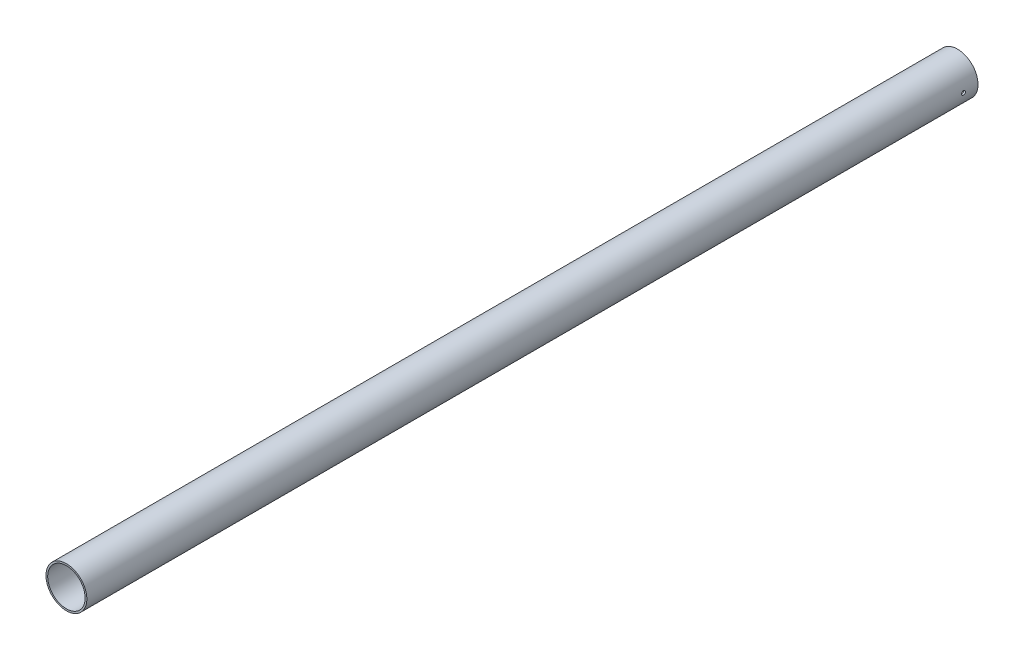
ISO-10303-21;
HEADER;
FILE_DESCRIPTION(('STEP AP214'),'2;1');
FILE_NAME('part.step','',(''),(''),'','','');
FILE_SCHEMA(('AUTOMOTIVE_DESIGN { 1 0 10303 214 1 1 1 1 }'));
ENDSEC;
DATA;
#1=APPLICATION_CONTEXT('core data for automotive mechanical design processes');
#2=APPLICATION_PROTOCOL_DEFINITION('international standard','automotive_design',2000,#1);
#3=PRODUCT_CONTEXT('',#1,'mechanical');
#4=PRODUCT('Part','Part','',(#3));
#5=PRODUCT_RELATED_PRODUCT_CATEGORY('part','',(#4));
#6=PRODUCT_DEFINITION_FORMATION('','',#4);
#7=PRODUCT_DEFINITION_CONTEXT('part definition',#1,'design');
#8=PRODUCT_DEFINITION('design','',#6,#7);
#9=PRODUCT_DEFINITION_SHAPE('','',#8);
#10=(LENGTH_UNIT() NAMED_UNIT(*) SI_UNIT(.MILLI.,.METRE.));
#11=(NAMED_UNIT(*) PLANE_ANGLE_UNIT() SI_UNIT($,.RADIAN.));
#12=(NAMED_UNIT(*) SI_UNIT($,.STERADIAN.) SOLID_ANGLE_UNIT());
#13=UNCERTAINTY_MEASURE_WITH_UNIT(LENGTH_MEASURE(1.E-05),#10,'distance_accuracy_value','');
#14=(GEOMETRIC_REPRESENTATION_CONTEXT(3) GLOBAL_UNCERTAINTY_ASSIGNED_CONTEXT((#13)) GLOBAL_UNIT_ASSIGNED_CONTEXT((#10,
#11,#12)) REPRESENTATION_CONTEXT('',''));
#15=CARTESIAN_POINT('',(0.,0.,0.));
#16=DIRECTION('',(0.,0.,1.));
#17=DIRECTION('',(1.,0.,0.));
#18=AXIS2_PLACEMENT_3D('',#15,#16,#17);
#19=CARTESIAN_POINT('',(0.,0.,553.63));
#20=DIRECTION('',(0.,0.,1.));
#21=DIRECTION('',(1.,0.,0.));
#22=AXIS2_PLACEMENT_3D('',#19,#20,#21);
#23=PLANE('',#22);
#24=CARTESIAN_POINT('',(0.,0.,553.63));
#25=DIRECTION('',(0.,0.,1.));
#26=DIRECTION('',(1.,0.,0.));
#27=AXIS2_PLACEMENT_3D('',#24,#25,#26);
#28=CIRCLE('',#27,12.7);
#29=CARTESIAN_POINT('',(12.7,0.,553.63));
#30=VERTEX_POINT('',#29);
#31=EDGE_CURVE('E54',#30,#30,#28,.T.);
#32=ORIENTED_EDGE('',*,*,#31,.T.);
#33=EDGE_LOOP('',(#32));
#34=FACE_BOUND('',#33,.T.);
#35=CARTESIAN_POINT('',(0.,0.,553.63));
#36=DIRECTION('',(0.,0.,1.));
#37=DIRECTION('',(1.,0.,0.));
#38=AXIS2_PLACEMENT_3D('',#35,#36,#37);
#39=CIRCLE('',#38,11.6205);
#40=CARTESIAN_POINT('',(11.6205,0.,553.63));
#41=VERTEX_POINT('',#40);
#42=EDGE_CURVE('E91',#41,#41,#39,.T.);
#43=ORIENTED_EDGE('',*,*,#42,.F.);
#44=EDGE_LOOP('',(#43));
#45=FACE_BOUND('',#44,.T.);
#46=ADVANCED_FACE('F36',(#34,#45),#23,.T.);
#47=CARTESIAN_POINT('',(0.,0.,0.));
#48=DIRECTION('',(0.,0.,1.));
#49=DIRECTION('',(1.,0.,0.));
#50=AXIS2_PLACEMENT_3D('',#47,#48,#49);
#51=PLANE('',#50);
#52=CARTESIAN_POINT('',(0.,0.,0.));
#53=DIRECTION('',(0.,0.,1.));
#54=DIRECTION('',(1.,0.,0.));
#55=AXIS2_PLACEMENT_3D('',#52,#53,#54);
#56=CIRCLE('',#55,12.7);
#57=CARTESIAN_POINT('',(12.7,0.,0.));
#58=VERTEX_POINT('',#57);
#59=EDGE_CURVE('E59',#58,#58,#56,.T.);
#60=ORIENTED_EDGE('',*,*,#59,.F.);
#61=EDGE_LOOP('',(#60));
#62=FACE_BOUND('',#61,.T.);
#63=CARTESIAN_POINT('',(0.,0.,0.));
#64=DIRECTION('',(0.,0.,1.));
#65=DIRECTION('',(1.,0.,0.));
#66=AXIS2_PLACEMENT_3D('',#63,#64,#65);
#67=CIRCLE('',#66,11.6205);
#68=CARTESIAN_POINT('',(11.6205,0.,0.));
#69=VERTEX_POINT('',#68);
#70=EDGE_CURVE('E86',#69,#69,#67,.T.);
#71=ORIENTED_EDGE('',*,*,#70,.T.);
#72=EDGE_LOOP('',(#71));
#73=FACE_BOUND('',#72,.T.);
#74=ADVANCED_FACE('F99',(#62,#73),#51,.F.);
#75=CARTESIAN_POINT('',(0.,0.,553.63));
#76=DIRECTION('',(0.,0.,-1.));
#77=DIRECTION('',(-1.,0.,0.));
#78=AXIS2_PLACEMENT_3D('',#75,#76,#77);
#79=CYLINDRICAL_SURFACE('',#78,12.7);
#80=CARTESIAN_POINT('',(-12.7,0.,7.8));
#81=CARTESIAN_POINT('',(-12.6999992647351,0.0672436645791881,7.80000292110959));
#82=CARTESIAN_POINT('',(-12.6994602583645,0.134532250113994,7.80567116161042));
#83=CARTESIAN_POINT('',(-12.6973618829489,0.267245238753763,7.82819805892377));
#84=CARTESIAN_POINT('',(-12.6958013786043,0.332667483068381,7.84506916697964));
#85=CARTESIAN_POINT('',(-12.6918362274279,0.459706661698656,7.88950742482808));
#86=CARTESIAN_POINT('',(-12.6894320792388,0.521325818618373,7.91706825737999));
#87=CARTESIAN_POINT('',(-12.6840487416453,0.63904956472979,7.98209167980071));
#88=CARTESIAN_POINT('',(-12.6810696696504,0.695155276339263,8.01955224854545));
#89=CARTESIAN_POINT('',(-12.6748596357844,0.800454668942981,8.10344191042882));
#90=CARTESIAN_POINT('',(-12.6716279754825,0.849628048880857,8.1498964363571));
#91=CARTESIAN_POINT('',(-12.6652827978562,0.939492536562182,8.25040123796989));
#92=CARTESIAN_POINT('',(-12.6621692859032,0.980183259034829,8.30445185847214));
#93=CARTESIAN_POINT('',(-12.6564056786671,1.05199827487853,8.41874031392843));
#94=CARTESIAN_POINT('',(-12.6537564692717,1.08310436467755,8.47898963589863));
#95=CARTESIAN_POINT('',(-12.6492298785415,1.13475088033833,8.60388544776417));
#96=CARTESIAN_POINT('',(-12.6473524800529,1.15529154102306,8.66853183989585));
#97=CARTESIAN_POINT('',(-12.6445882565911,1.18516434657597,8.80018078070263));
#98=CARTESIAN_POINT('',(-12.6436984725554,1.19452998010332,8.86717566721294));
#99=CARTESIAN_POINT('',(-12.6430009858318,1.2018903732235,9.0017919315644));
#100=CARTESIAN_POINT('',(-12.64319325756,1.19988540166057,9.06941329455553));
#101=CARTESIAN_POINT('',(-12.644635459794,1.18458912582194,9.20313261711031));
#102=CARTESIAN_POINT('',(-12.6458819693004,1.17133432672263,9.26923479460722));
#103=CARTESIAN_POINT('',(-12.6492868463526,1.1339714218254,9.39827206357135));
#104=CARTESIAN_POINT('',(-12.6514452250248,1.10986318359523,9.46120711638331));
#105=CARTESIAN_POINT('',(-12.6564345841342,1.05143724752191,9.58223931649146));
#106=CARTESIAN_POINT('',(-12.6592666343216,1.01710328976211,9.64032856873999));
#107=CARTESIAN_POINT('',(-12.6652833045372,0.939212226192871,9.74993385326778));
#108=CARTESIAN_POINT('',(-12.6684679337701,0.895654879561493,9.80144971386001));
#109=CARTESIAN_POINT('',(-12.6748461723438,0.800349280584357,9.89665804404941));
#110=CARTESIAN_POINT('',(-12.6780397677479,0.748569490103312,9.94031895044983));
#111=CARTESIAN_POINT('',(-12.6840642400147,0.638398534577093,10.0183335706764));
#112=CARTESIAN_POINT('',(-12.6868951165338,0.580007363270718,10.0526872756883));
#113=CARTESIAN_POINT('',(-12.6918759754523,0.458249762567131,10.1111108065502));
#114=CARTESIAN_POINT('',(-12.6940258565343,0.39488259459694,10.1351791023379));
#115=CARTESIAN_POINT('',(-12.6974014179635,0.264981758608645,10.1723258349013));
#116=CARTESIAN_POINT('',(-12.6986271229789,0.198448175158765,10.185404565011));
#117=CARTESIAN_POINT('',(-12.7000130615517,0.0643765766885857,10.2001610317479));
#118=CARTESIAN_POINT('',(-12.700177366823,-0.00315660256509824,10.2018823379735));
#119=CARTESIAN_POINT('',(-12.699432896081,-0.137550513798226,10.1939894255829));
#120=CARTESIAN_POINT('',(-12.6985241329862,-0.204411253863348,10.1843753434327));
#121=CARTESIAN_POINT('',(-12.695738284362,-0.335437135549339,10.1541206969873));
#122=CARTESIAN_POINT('',(-12.6938629842485,-0.399607012285763,10.1335004610956));
#123=CARTESIAN_POINT('',(-12.6893545416645,-0.523576627788468,10.081839685859));
#124=CARTESIAN_POINT('',(-12.6867213839395,-0.583376278558557,10.0507989367634));
#125=CARTESIAN_POINT('',(-12.6809818377794,-0.69710539349013,9.97906971127578));
#126=CARTESIAN_POINT('',(-12.677874051145,-0.751016678858039,9.93835252544696));
#127=CARTESIAN_POINT('',(-12.671538680543,-0.851254884069771,9.84846750987874));
#128=CARTESIAN_POINT('',(-12.6683110938964,-0.897581634190501,9.7992994910811));
#129=CARTESIAN_POINT('',(-12.662087709054,-0.981486362284095,9.69371876400525));
#130=CARTESIAN_POINT('',(-12.6590926875178,-1.01903580222673,9.63728332443466));
#131=CARTESIAN_POINT('',(-12.6536850894959,-1.08412401495575,9.51888222746228));
#132=CARTESIAN_POINT('',(-12.6512725057894,-1.11166291185015,9.45691663863365));
#133=CARTESIAN_POINT('',(-12.6473076389668,-1.15590024040374,9.32931320204592));
#134=CARTESIAN_POINT('',(-12.6457539952817,-1.17261582352431,9.26368134434372));
#135=CARTESIAN_POINT('',(-12.6436785869436,-1.19478774945327,9.13052713180316));
#136=CARTESIAN_POINT('',(-12.6431567961441,-1.20024437755629,9.06300482491151));
#137=CARTESIAN_POINT('',(-12.6432046673143,-1.19973977686572,8.92827005230846));
#138=CARTESIAN_POINT('',(-12.6437700436999,-1.19382338026117,8.86105741265753));
#139=CARTESIAN_POINT('',(-12.6459194194394,-1.17083449453073,8.72858526111938));
#140=CARTESIAN_POINT('',(-12.647503420095,-1.15376199114879,8.6633257517281));
#141=CARTESIAN_POINT('',(-12.6515104007557,-1.10895754365353,8.53661155895532));
#142=CARTESIAN_POINT('',(-12.6539332907887,-1.08122674262402,8.47515646837689));
#143=CARTESIAN_POINT('',(-12.6593452297627,-1.01589760947404,8.35776621977284));
#144=CARTESIAN_POINT('',(-12.662334273539,-0.978299367367613,8.30183101139945));
#145=CARTESIAN_POINT('',(-12.6685558185134,-0.894134111279764,8.196838600714));
#146=CARTESIAN_POINT('',(-12.6717891970951,-0.847533739505933,8.14780819064974));
#147=CARTESIAN_POINT('',(-12.6781270617199,-0.746751576404293,8.0582424423319));
#148=CARTESIAN_POINT('',(-12.6812315165959,-0.692567965517046,8.01770914876575));
#149=CARTESIAN_POINT('',(-12.6869689662881,-0.578024127382161,7.94621723636115));
#150=CARTESIAN_POINT('',(-12.6896008678755,-0.51765007272362,7.91528070193364));
#151=CARTESIAN_POINT('',(-12.6940845081993,-0.39257889087562,7.86402498077978));
#152=CARTESIAN_POINT('',(-12.6959371321351,-0.327886766038709,7.84369374091456));
#153=CARTESIAN_POINT('',(-12.6981844213502,-0.21901908840564,7.81933347671279));
#154=CARTESIAN_POINT('',(-12.6988621150258,-0.175541004145001,7.81209323382703));
#155=CARTESIAN_POINT('',(-12.6997701442889,-0.0880483662317025,7.80242554767123));
#156=CARTESIAN_POINT('',(-12.7000004814806,-0.0440338145034741,7.79999808714176));
#157=CARTESIAN_POINT('',(-12.7,0.,7.8));
#158=B_SPLINE_CURVE_WITH_KNOTS('',3,(#80,#81,#82,#83,#84,#85,#86,#87,#88,#89,#90,#91,#92,#93,
#94,#95,#96,#97,#98,#99,#100,#101,#102,#103,#104,#105,#106,#107,#108,#109,#110,#111,#112,#113,
#114,#115,#116,#117,#118,#119,#120,#121,#122,#123,#124,#125,#126,#127,#128,#129,#130,#131,#132,
#133,#134,#135,#136,#137,#138,#139,#140,#141,#142,#143,#144,#145,#146,#147,#148,#149,#150,#151,
#152,#153,#154,#155,#156,#157),.UNSPECIFIED.,.T.,.F.,(4,2,2,2,2,2,2,2,2,2,2,2,2,2,2,2,2,2,2,2,2,
2,2,2,2,2,2,2,2,2,2,2,2,2,2,2,2,2,4),(0.,0.201570207034533,0.403364821789229,0.605040364479121,
0.806674764979918,1.0088878949915,1.21111020724929,1.41371425510745,1.61631379977508,
1.81830466893997,2.02029076229449,2.2216239149406,2.42295952429426,2.62461700233744,
2.82627974629062,3.02873555451505,3.23119155447361,3.43367766140465,3.63615836339395,
3.83786185059291,4.03956290952137,4.24089270855193,4.44222656031969,4.64416538445326,
4.84610872685956,5.04869979653931,5.25128835446376,5.45355508403256,5.65581668823045,
5.85728261681534,6.05874880284791,6.26019338801046,6.46163613559342,6.66384017563344,
6.86609281694631,7.06880749458907,7.27129127801421,7.40328790538686,7.53528405939677),.UNSPECIFIED.);
#159=CARTESIAN_POINT('',(-12.7,0.,7.8));
#160=VERTEX_POINT('',#159);
#161=EDGE_CURVE('E10',#160,#160,#158,.T.);
#162=ORIENTED_EDGE('',*,*,#161,.T.);
#163=EDGE_LOOP('',(#162));
#164=FACE_BOUND('',#163,.T.);
#165=CARTESIAN_POINT('',(12.7,0.,10.2));
#166=CARTESIAN_POINT('',(12.6999992647351,0.0672436645791882,10.1999970788904));
#167=CARTESIAN_POINT('',(12.6994602583645,0.134532250113994,10.1943288383896));
#168=CARTESIAN_POINT('',(12.6973618829489,0.267245238753763,10.1718019410762));
#169=CARTESIAN_POINT('',(12.6958013786043,0.332667483068382,10.1549308330204));
#170=CARTESIAN_POINT('',(12.6918362274279,0.459706661698656,10.1104925751719));
#171=CARTESIAN_POINT('',(12.6894320792388,0.521325818618373,10.08293174262));
#172=CARTESIAN_POINT('',(12.6840487416453,0.63904956472979,10.0179083201993));
#173=CARTESIAN_POINT('',(12.6810696696504,0.695155276339263,9.98044775145455));
#174=CARTESIAN_POINT('',(12.6748596357844,0.800454668942981,9.89655808957117));
#175=CARTESIAN_POINT('',(12.6716279754825,0.849628048880857,9.8501035636429));
#176=CARTESIAN_POINT('',(12.6652827978562,0.939492536562182,9.74959876203011));
#177=CARTESIAN_POINT('',(12.6621692859032,0.980183259034829,9.69554814152786));
#178=CARTESIAN_POINT('',(12.6564056786671,1.05199827487853,9.58125968607156));
#179=CARTESIAN_POINT('',(12.6537564692717,1.08310436467755,9.52101036410136));
#180=CARTESIAN_POINT('',(12.6492298785415,1.13475088033833,9.39611455223582));
#181=CARTESIAN_POINT('',(12.6473524800529,1.15529154102306,9.33146816010414));
#182=CARTESIAN_POINT('',(12.6445882565911,1.18516434657597,9.19981921929736));
#183=CARTESIAN_POINT('',(12.6436984725554,1.19452998010332,9.13282433278706));
#184=CARTESIAN_POINT('',(12.6430009858318,1.2018903732235,8.9982080684356));
#185=CARTESIAN_POINT('',(12.64319325756,1.19988540166057,8.93058670544446));
#186=CARTESIAN_POINT('',(12.644635459794,1.18458912582194,8.79686738288969));
#187=CARTESIAN_POINT('',(12.6458819693004,1.17133432672263,8.73076520539277));
#188=CARTESIAN_POINT('',(12.6492868463526,1.1339714218254,8.60172793642865));
#189=CARTESIAN_POINT('',(12.6514452250248,1.10986318359523,8.53879288361669));
#190=CARTESIAN_POINT('',(12.6564345841342,1.05143724752191,8.41776068350854));
#191=CARTESIAN_POINT('',(12.6592666343216,1.01710328976211,8.35967143126001));
#192=CARTESIAN_POINT('',(12.6652833045372,0.939212226192871,8.25006614673222));
#193=CARTESIAN_POINT('',(12.6684679337701,0.895654879561493,8.19855028613999));
#194=CARTESIAN_POINT('',(12.6748461723438,0.800349280584357,8.10334195595059));
#195=CARTESIAN_POINT('',(12.6780397677479,0.748569490103312,8.05968104955017));
#196=CARTESIAN_POINT('',(12.6840642400147,0.638398534577093,7.98166642932355));
#197=CARTESIAN_POINT('',(12.6868951165338,0.580007363270718,7.94731272431169));
#198=CARTESIAN_POINT('',(12.6918759754523,0.458249762567131,7.88888919344984));
#199=CARTESIAN_POINT('',(12.6940258565343,0.39488259459694,7.86482089766205));
#200=CARTESIAN_POINT('',(12.6974014179635,0.264981758608645,7.82767416509869));
#201=CARTESIAN_POINT('',(12.6986271229789,0.198448175158765,7.81459543498905));
#202=CARTESIAN_POINT('',(12.7000130615517,0.0643765766885853,7.79983896825208));
#203=CARTESIAN_POINT('',(12.700177366823,-0.00315660256509866,7.79811766202649));
#204=CARTESIAN_POINT('',(12.699432896081,-0.137550513798226,7.80601057441712));
#205=CARTESIAN_POINT('',(12.6985241329862,-0.204411253863348,7.81562465656734));
#206=CARTESIAN_POINT('',(12.695738284362,-0.33543713554934,7.84587930301268));
#207=CARTESIAN_POINT('',(12.6938629842485,-0.399607012285764,7.86649953890442));
#208=CARTESIAN_POINT('',(12.6893545416645,-0.523576627788469,7.918160314141));
#209=CARTESIAN_POINT('',(12.6867213839395,-0.583376278558557,7.94920106323655));
#210=CARTESIAN_POINT('',(12.6809818377794,-0.697105393490131,8.02093028872422));
#211=CARTESIAN_POINT('',(12.677874051145,-0.751016678858039,8.06164747455304));
#212=CARTESIAN_POINT('',(12.671538680543,-0.851254884069771,8.15153249012126));
#213=CARTESIAN_POINT('',(12.6683110938964,-0.897581634190501,8.2007005089189));
#214=CARTESIAN_POINT('',(12.662087709054,-0.981486362284096,8.30628123599475));
#215=CARTESIAN_POINT('',(12.6590926875178,-1.01903580222673,8.36271667556534));
#216=CARTESIAN_POINT('',(12.6536850894959,-1.08412401495575,8.48111777253772));
#217=CARTESIAN_POINT('',(12.6512725057894,-1.11166291185015,8.54308336136635));
#218=CARTESIAN_POINT('',(12.6473076389668,-1.15590024040374,8.67068679795408));
#219=CARTESIAN_POINT('',(12.6457539952817,-1.17261582352431,8.73631865565628));
#220=CARTESIAN_POINT('',(12.6436785869436,-1.19478774945327,8.86947286819684));
#221=CARTESIAN_POINT('',(12.6431567961441,-1.20024437755629,8.93699517508849));
#222=CARTESIAN_POINT('',(12.6432046673143,-1.19973977686572,9.07172994769154));
#223=CARTESIAN_POINT('',(12.6437700436999,-1.19382338026117,9.13894258734246));
#224=CARTESIAN_POINT('',(12.6459194194394,-1.17083449453073,9.27141473888062));
#225=CARTESIAN_POINT('',(12.647503420095,-1.15376199114879,9.3366742482719));
#226=CARTESIAN_POINT('',(12.6515104007557,-1.10895754365353,9.46338844104468));
#227=CARTESIAN_POINT('',(12.6539332907887,-1.08122674262402,9.52484353162311));
#228=CARTESIAN_POINT('',(12.6593452297627,-1.01589760947404,9.64223378022716));
#229=CARTESIAN_POINT('',(12.662334273539,-0.978299367367613,9.69816898860055));
#230=CARTESIAN_POINT('',(12.6685558185134,-0.894134111279764,9.803161399286));
#231=CARTESIAN_POINT('',(12.6717891970951,-0.847533739505933,9.85219180935026));
#232=CARTESIAN_POINT('',(12.6781270617199,-0.746751576404293,9.9417575576681));
#233=CARTESIAN_POINT('',(12.6812315165959,-0.692567965517046,9.98229085123425));
#234=CARTESIAN_POINT('',(12.6869689662881,-0.578024127382162,10.0537827636388));
#235=CARTESIAN_POINT('',(12.6896008678755,-0.51765007272362,10.0847192980664));
#236=CARTESIAN_POINT('',(12.6940845081993,-0.39257889087562,10.1359750192202));
#237=CARTESIAN_POINT('',(12.6959371321351,-0.32788676603871,10.1563062590854));
#238=CARTESIAN_POINT('',(12.6981844213502,-0.21901908840564,10.1806665232872));
#239=CARTESIAN_POINT('',(12.6988621150258,-0.175541004145001,10.187906766173));
#240=CARTESIAN_POINT('',(12.6997701442889,-0.0880483662317023,10.1975744523288));
#241=CARTESIAN_POINT('',(12.7000004814806,-0.044033814503474,10.2000019128582));
#242=CARTESIAN_POINT('',(12.7,0.,10.2));
#243=B_SPLINE_CURVE_WITH_KNOTS('',3,(#165,#166,#167,#168,#169,#170,#171,#172,#173,#174,#175,
#176,#177,#178,#179,#180,#181,#182,#183,#184,#185,#186,#187,#188,#189,#190,#191,#192,#193,#194,
#195,#196,#197,#198,#199,#200,#201,#202,#203,#204,#205,#206,#207,#208,#209,#210,#211,#212,#213,
#214,#215,#216,#217,#218,#219,#220,#221,#222,#223,#224,#225,#226,#227,#228,#229,#230,#231,#232,
#233,#234,#235,#236,#237,#238,#239,#240,#241,#242),.UNSPECIFIED.,.T.,.F.,(4,2,2,2,2,2,2,2,2,2,2,
2,2,2,2,2,2,2,2,2,2,2,2,2,2,2,2,2,2,2,2,2,2,2,2,2,2,2,4),(0.,0.201570207034533,
0.403364821789229,0.605040364479121,0.806674764979918,1.0088878949915,1.21111020724929,
1.41371425510745,1.61631379977508,1.81830466893998,2.02029076229449,2.2216239149406,
2.42295952429426,2.62461700233744,2.82627974629062,3.02873555451505,3.23119155447361,
3.43367766140465,3.63615836339395,3.83786185059291,4.03956290952137,4.24089270855193,
4.44222656031969,4.64416538445326,4.84610872685956,5.04869979653932,5.25128835446376,
5.45355508403256,5.65581668823045,5.85728261681534,6.05874880284791,6.26019338801046,
6.46163613559342,6.66384017563344,6.86609281694631,7.06880749458907,7.27129127801421,
7.40328790538686,7.53528405939677),.UNSPECIFIED.);
#244=CARTESIAN_POINT('',(12.7,0.,10.2));
#245=VERTEX_POINT('',#244);
#246=EDGE_CURVE('E49',#245,#245,#243,.T.);
#247=ORIENTED_EDGE('',*,*,#246,.T.);
#248=EDGE_LOOP('',(#247));
#249=FACE_BOUND('',#248,.T.);
#250=ORIENTED_EDGE('',*,*,#31,.F.);
#251=EDGE_LOOP('',(#250));
#252=FACE_BOUND('',#251,.T.);
#253=ORIENTED_EDGE('',*,*,#59,.T.);
#254=EDGE_LOOP('',(#253));
#255=FACE_BOUND('',#254,.T.);
#256=ADVANCED_FACE('F38',(#164,#249,#252,#255),#79,.T.);
#257=CARTESIAN_POINT('',(0.,0.,553.63));
#258=DIRECTION('',(0.,0.,-1.));
#259=DIRECTION('',(-1.,0.,0.));
#260=AXIS2_PLACEMENT_3D('',#257,#258,#259);
#261=CYLINDRICAL_SURFACE('',#260,11.6205);
#262=CARTESIAN_POINT('',(-11.6205,0.,10.2));
#263=CARTESIAN_POINT('',(-11.6204992038423,-0.0672125181851825,10.1999970953361));
#264=CARTESIAN_POINT('',(-11.6199106762744,-0.134469186673739,10.194334081336));
#265=CARTESIAN_POINT('',(-11.6176195171319,-0.267117090348463,10.1718291585458));
#266=CARTESIAN_POINT('',(-11.6159156657229,-0.332506201164537,10.1549750096744));
#267=CARTESIAN_POINT('',(-11.6115861475893,-0.45947897111501,10.1105844114608));
#268=CARTESIAN_POINT('',(-11.6089610452713,-0.521064933152808,10.0830545015693));
#269=CARTESIAN_POINT('',(-11.6030823718001,-0.638728756318107,10.0181067482352));
#270=CARTESIAN_POINT('',(-11.5998289236115,-0.694807691913816,9.98069083891475));
#271=CARTESIAN_POINT('',(-11.5930439491489,-0.800093299021603,9.89687968643869));
#272=CARTESIAN_POINT('',(-11.5895115143825,-0.849275938513217,9.85045432436527));
#273=CARTESIAN_POINT('',(-11.5825741839121,-0.939166231681752,9.75000642301018));
#274=CARTESIAN_POINT('',(-11.5791692941808,-0.979873488880333,9.69598352851397));
#275=CARTESIAN_POINT('',(-11.5728633319526,-1.05174318451593,9.58172289888097));
#276=CARTESIAN_POINT('',(-11.5699634191115,-1.08288377557799,9.52147135230016));
#277=CARTESIAN_POINT('',(-11.5650071121611,-1.13459666913028,9.39655940826942));
#278=CARTESIAN_POINT('',(-11.5629506959099,-1.15516924903619,9.3318991266015));
#279=CARTESIAN_POINT('',(-11.5599224939468,-1.18509065781283,9.20025087782907));
#280=CARTESIAN_POINT('',(-11.5589468476618,-1.19447944495643,9.1332720828586));
#281=CARTESIAN_POINT('',(-11.5581786896727,-1.2018902886349,8.99868283345914));
#282=CARTESIAN_POINT('',(-11.5583861449333,-1.1999126625487,8.93107239671981));
#283=CARTESIAN_POINT('',(-11.5599572236431,-1.18467973566489,8.79741487698642));
#284=CARTESIAN_POINT('',(-11.5613163696088,-1.17146810913993,8.73136275640326));
#285=CARTESIAN_POINT('',(-11.5650306958371,-1.13421018916511,8.60241837210571));
#286=CARTESIAN_POINT('',(-11.5673858903575,-1.1101637406209,8.53952615363784));
#287=CARTESIAN_POINT('',(-11.5728320866751,-1.05187070917432,8.41854915875891));
#288=CARTESIAN_POINT('',(-11.5759244806058,-1.01760479663611,8.36047376159529));
#289=CARTESIAN_POINT('',(-11.582495476541,-0.939859402777191,8.25088160854655));
#290=CARTESIAN_POINT('',(-11.5859740906016,-0.896379633800532,8.19936505750854));
#291=CARTESIAN_POINT('',(-11.5929455219165,-0.801197049477811,8.10409920679147));
#292=CARTESIAN_POINT('',(-11.5964383290318,-0.749456524510395,8.06038757418467));
#293=CARTESIAN_POINT('',(-11.6030291645463,-0.63935196351974,7.98226447933885));
#294=CARTESIAN_POINT('',(-11.6061271924571,-0.580987919301705,7.94785302860644));
#295=CARTESIAN_POINT('',(-11.6115805217569,-0.459266614835023,7.88930844198384));
#296=CARTESIAN_POINT('',(-11.6139356812055,-0.39590840323433,7.86517727004539));
#297=CARTESIAN_POINT('',(-11.6176364842742,-0.266009809918713,7.82790611266701));
#298=CARTESIAN_POINT('',(-11.6189821600937,-0.199469529773554,7.81476577665325));
#299=CARTESIAN_POINT('',(-11.6205082323637,-0.0654217711977601,7.79989720449923));
#300=CARTESIAN_POINT('',(-11.6206939350462,0.00207988513522879,7.79811700125993));
#301=CARTESIAN_POINT('',(-11.6198933772271,0.136420586397389,7.80588266080431));
#302=CARTESIAN_POINT('',(-11.6189071336289,0.20325964086938,7.8154283602322));
#303=CARTESIAN_POINT('',(-11.6158768905829,0.33422743543872,7.84553173761693));
#304=CARTESIAN_POINT('',(-11.6138352337784,0.398361839304932,7.86606503054404));
#305=CARTESIAN_POINT('',(-11.6089231512165,0.522275979426399,7.91753563568623));
#306=CARTESIAN_POINT('',(-11.6060527057147,0.582055611895209,7.94847319576562));
#307=CARTESIAN_POINT('',(-11.5997907708419,0.695797907184917,8.02000263720679));
#308=CARTESIAN_POINT('',(-11.5963974574374,0.749739035422661,8.06062859943978));
#309=CARTESIAN_POINT('',(-11.5894762589774,0.85005501671239,8.15033283452385));
#310=CARTESIAN_POINT('',(-11.5859483703179,0.896429666945258,8.19941133387236));
#311=CARTESIAN_POINT('',(-11.5791396224576,0.980477190999694,8.30485449462328));
#312=CARTESIAN_POINT('',(-11.5758597653431,1.01811591753233,8.36124644829957));
#313=CARTESIAN_POINT('',(-11.5699338282386,1.08338828858842,8.47958140242207));
#314=CARTESIAN_POINT('',(-11.567287739087,1.1110220777431,8.54152432260747));
#315=CARTESIAN_POINT('',(-11.5629352624361,1.15544320730908,8.66908659203437));
#316=CARTESIAN_POINT('',(-11.5612271265136,1.17225073896339,8.73469884792047));
#317=CARTESIAN_POINT('',(-11.5589385757209,1.19460770837715,8.86783280079622));
#318=CARTESIAN_POINT('',(-11.5583581261636,1.20015749241893,8.93535443898951));
#319=CARTESIAN_POINT('',(-11.5583914317392,1.19983644091773,9.07005103352647));
#320=CARTESIAN_POINT('',(-11.5589995779227,1.19401924585189,9.13722612553509));
#321=CARTESIAN_POINT('',(-11.5613295807501,1.17124196628742,9.26963920642339));
#322=CARTESIAN_POINT('',(-11.5630514385338,1.1542818703845,9.33487719332045));
#323=CARTESIAN_POINT('',(-11.5674132772164,1.10971526622723,9.46156298990711));
#324=CARTESIAN_POINT('',(-11.5700531117591,1.08211045502145,9.52301140194455));
#325=CARTESIAN_POINT('',(-11.5759537505419,1.01704350248294,9.6404114200308));
#326=CARTESIAN_POINT('',(-11.5792145526524,0.979581394953524,9.69636304492867));
#327=CARTESIAN_POINT('',(-11.5860081546658,0.89566203233042,9.80145609704216));
#328=CARTESIAN_POINT('',(-11.5895421200493,0.849164789220496,9.85056551848437));
#329=CARTESIAN_POINT('',(-11.5964732486946,0.748574963634493,9.94030792263548));
#330=CARTESIAN_POINT('',(-11.5998703790528,0.694480568195118,9.98093887629641));
#331=CARTESIAN_POINT('',(-11.6061545706277,0.580073096903424,10.0526571986532));
#332=CARTESIAN_POINT('',(-11.6090402485313,0.519743834123639,10.0837188478657));
#333=CARTESIAN_POINT('',(-11.6139615248196,0.394733979829618,10.1352291786812));
#334=CARTESIAN_POINT('',(-11.6159980770845,0.330058366259914,10.1556897754698));
#335=CARTESIAN_POINT('',(-11.6184823532737,0.220850142547215,10.1803392544273));
#336=CARTESIAN_POINT('',(-11.6192354241306,0.177014621281277,10.1877018995775));
#337=CARTESIAN_POINT('',(-11.6202445093851,0.088792488849783,10.1975332209513));
#338=CARTESIAN_POINT('',(-11.6205005260045,0.0444058801483485,10.2000019190496));
#339=CARTESIAN_POINT('',(-11.6205,0.,10.2));
#340=B_SPLINE_CURVE_WITH_KNOTS('',3,(#262,#263,#264,#265,#266,#267,#268,#269,#270,#271,#272,
#273,#274,#275,#276,#277,#278,#279,#280,#281,#282,#283,#284,#285,#286,#287,#288,#289,#290,#291,
#292,#293,#294,#295,#296,#297,#298,#299,#300,#301,#302,#303,#304,#305,#306,#307,#308,#309,#310,
#311,#312,#313,#314,#315,#316,#317,#318,#319,#320,#321,#322,#323,#324,#325,#326,#327,#328,#329,
#330,#331,#332,#333,#334,#335,#336,#337,#338,#339),.UNSPECIFIED.,.T.,.F.,(4,2,2,2,2,2,2,2,2,2,2,
2,2,2,2,2,2,2,2,2,2,2,2,2,2,2,2,2,2,2,2,2,2,2,2,2,2,2,4),(0.,0.201475395487696,0.40317151446012,
0.604744278888133,0.806277636270348,1.00849670855987,1.21072523853216,1.41341222192199,
1.61609388440343,1.81804919792882,2.01999887237976,2.22116700064646,2.42233800861251,
2.6238919616698,2.82545220815474,3.02796034937364,3.23046874114381,3.43301580293058,
3.63555640384348,3.83716981151566,4.03878031131202,4.23994521661209,4.44111491467,
4.64300298560269,4.84489646724766,5.04756630409765,5.2502332110386,5.45252103622867,
5.65480263905826,5.85613198528638,6.05746153756685,6.25875900586418,6.46005578386743,
6.6622646398562,6.86452183265715,7.06731798408248,7.26988570305454,7.40299680343087,
7.53610730883133),.UNSPECIFIED.);
#341=CARTESIAN_POINT('',(-11.6205,0.,10.2));
#342=VERTEX_POINT('',#341);
#343=EDGE_CURVE('E87',#342,#342,#340,.T.);
#344=ORIENTED_EDGE('',*,*,#343,.F.);
#345=EDGE_LOOP('',(#344));
#346=FACE_BOUND('',#345,.T.);
#347=CARTESIAN_POINT('',(11.6205,0.,10.2));
#348=CARTESIAN_POINT('',(11.6204992038423,0.067212518185183,10.1999970953361));
#349=CARTESIAN_POINT('',(11.6199106762744,0.13446918667374,10.194334081336));
#350=CARTESIAN_POINT('',(11.6176195171319,0.267117090348464,10.1718291585458));
#351=CARTESIAN_POINT('',(11.6159156657229,0.332506201164537,10.1549750096744));
#352=CARTESIAN_POINT('',(11.6115861475893,0.45947897111501,10.1105844114608));
#353=CARTESIAN_POINT('',(11.6089610452713,0.521064933152808,10.0830545015693));
#354=CARTESIAN_POINT('',(11.6030823718001,0.638728756318107,10.0181067482352));
#355=CARTESIAN_POINT('',(11.5998289236115,0.694807691913816,9.98069083891475));
#356=CARTESIAN_POINT('',(11.5930439491489,0.800093299021604,9.89687968643869));
#357=CARTESIAN_POINT('',(11.5895115143825,0.849275938513217,9.85045432436527));
#358=CARTESIAN_POINT('',(11.5825741839121,0.939166231681753,9.75000642301018));
#359=CARTESIAN_POINT('',(11.5791692941808,0.979873488880333,9.69598352851396));
#360=CARTESIAN_POINT('',(11.5728633319526,1.05174318451593,9.58172289888097));
#361=CARTESIAN_POINT('',(11.5699634191115,1.08288377557799,9.52147135230016));
#362=CARTESIAN_POINT('',(11.5650071121611,1.13459666913028,9.39655940826942));
#363=CARTESIAN_POINT('',(11.5629506959099,1.15516924903619,9.3318991266015));
#364=CARTESIAN_POINT('',(11.5599224939468,1.18509065781283,9.20025087782907));
#365=CARTESIAN_POINT('',(11.5589468476618,1.19447944495643,9.1332720828586));
#366=CARTESIAN_POINT('',(11.5581786896727,1.2018902886349,8.99868283345914));
#367=CARTESIAN_POINT('',(11.5583861449333,1.1999126625487,8.93107239671981));
#368=CARTESIAN_POINT('',(11.5599572236431,1.18467973566489,8.79741487698642));
#369=CARTESIAN_POINT('',(11.5613163696088,1.17146810913993,8.73136275640326));
#370=CARTESIAN_POINT('',(11.5650306958371,1.13421018916511,8.60241837210571));
#371=CARTESIAN_POINT('',(11.5673858903575,1.1101637406209,8.53952615363784));
#372=CARTESIAN_POINT('',(11.5728320866751,1.05187070917432,8.41854915875891));
#373=CARTESIAN_POINT('',(11.5759244806058,1.01760479663611,8.36047376159529));
#374=CARTESIAN_POINT('',(11.582495476541,0.939859402777192,8.25088160854655));
#375=CARTESIAN_POINT('',(11.5859740906016,0.896379633800533,8.19936505750854));
#376=CARTESIAN_POINT('',(11.5929455219165,0.801197049477811,8.10409920679147));
#377=CARTESIAN_POINT('',(11.5964383290318,0.749456524510395,8.06038757418467));
#378=CARTESIAN_POINT('',(11.6030291645463,0.63935196351974,7.98226447933885));
#379=CARTESIAN_POINT('',(11.6061271924571,0.580987919301705,7.94785302860644));
#380=CARTESIAN_POINT('',(11.6115805217569,0.459266614835022,7.88930844198384));
#381=CARTESIAN_POINT('',(11.6139356812055,0.395908403234328,7.86517727004539));
#382=CARTESIAN_POINT('',(11.6176364842742,0.266009809918712,7.82790611266701));
#383=CARTESIAN_POINT('',(11.6189821600937,0.199469529773553,7.81476577665325));
#384=CARTESIAN_POINT('',(11.6205082323637,0.0654217711977598,7.79989720449923));
#385=CARTESIAN_POINT('',(11.6206939350462,-0.00207988513522909,7.79811700125993));
#386=CARTESIAN_POINT('',(11.6198933772271,-0.136420586397389,7.80588266080431));
#387=CARTESIAN_POINT('',(11.6189071336289,-0.203259640869381,7.8154283602322));
#388=CARTESIAN_POINT('',(11.6158768905829,-0.33422743543872,7.84553173761693));
#389=CARTESIAN_POINT('',(11.6138352337784,-0.398361839304932,7.86606503054404));
#390=CARTESIAN_POINT('',(11.6089231512165,-0.522275979426399,7.91753563568623));
#391=CARTESIAN_POINT('',(11.6060527057147,-0.582055611895209,7.94847319576562));
#392=CARTESIAN_POINT('',(11.5997907708419,-0.695797907184917,8.02000263720679));
#393=CARTESIAN_POINT('',(11.5963974574374,-0.749739035422661,8.06062859943978));
#394=CARTESIAN_POINT('',(11.5894762589774,-0.85005501671239,8.15033283452385));
#395=CARTESIAN_POINT('',(11.5859483703179,-0.896429666945258,8.19941133387236));
#396=CARTESIAN_POINT('',(11.5791396224576,-0.980477190999694,8.30485449462328));
#397=CARTESIAN_POINT('',(11.5758597653431,-1.01811591753233,8.36124644829957));
#398=CARTESIAN_POINT('',(11.5699338282386,-1.08338828858842,8.47958140242207));
#399=CARTESIAN_POINT('',(11.567287739087,-1.1110220777431,8.54152432260747));
#400=CARTESIAN_POINT('',(11.5629352624361,-1.15544320730908,8.66908659203437));
#401=CARTESIAN_POINT('',(11.5612271265136,-1.17225073896339,8.73469884792047));
#402=CARTESIAN_POINT('',(11.5589385757209,-1.19460770837715,8.86783280079622));
#403=CARTESIAN_POINT('',(11.5583581261636,-1.20015749241893,8.93535443898951));
#404=CARTESIAN_POINT('',(11.5583914317392,-1.19983644091773,9.07005103352647));
#405=CARTESIAN_POINT('',(11.5589995779227,-1.19401924585189,9.13722612553509));
#406=CARTESIAN_POINT('',(11.5613295807501,-1.17124196628742,9.26963920642339));
#407=CARTESIAN_POINT('',(11.5630514385338,-1.1542818703845,9.33487719332045));
#408=CARTESIAN_POINT('',(11.5674132772164,-1.10971526622723,9.46156298990711));
#409=CARTESIAN_POINT('',(11.5700531117591,-1.08211045502145,9.52301140194455));
#410=CARTESIAN_POINT('',(11.5759537505419,-1.01704350248294,9.6404114200308));
#411=CARTESIAN_POINT('',(11.5792145526524,-0.979581394953524,9.69636304492867));
#412=CARTESIAN_POINT('',(11.5860081546658,-0.89566203233042,9.80145609704216));
#413=CARTESIAN_POINT('',(11.5895421200493,-0.849164789220496,9.85056551848437));
#414=CARTESIAN_POINT('',(11.5964732486946,-0.748574963634494,9.94030792263548));
#415=CARTESIAN_POINT('',(11.5998703790528,-0.694480568195119,9.98093887629641));
#416=CARTESIAN_POINT('',(11.6061545706277,-0.580073096903424,10.0526571986532));
#417=CARTESIAN_POINT('',(11.6090402485313,-0.519743834123638,10.0837188478657));
#418=CARTESIAN_POINT('',(11.6139615248196,-0.394733979829617,10.1352291786812));
#419=CARTESIAN_POINT('',(11.6159980770845,-0.330058366259913,10.1556897754698));
#420=CARTESIAN_POINT('',(11.6184823532737,-0.220850142547215,10.1803392544273));
#421=CARTESIAN_POINT('',(11.6192354241306,-0.177014621281277,10.1877018995775));
#422=CARTESIAN_POINT('',(11.6202445093851,-0.0887924888497832,10.1975332209513));
#423=CARTESIAN_POINT('',(11.6205005260045,-0.0444058801483486,10.2000019190496));
#424=CARTESIAN_POINT('',(11.6205,0.,10.2));
#425=B_SPLINE_CURVE_WITH_KNOTS('',3,(#347,#348,#349,#350,#351,#352,#353,#354,#355,#356,#357,
#358,#359,#360,#361,#362,#363,#364,#365,#366,#367,#368,#369,#370,#371,#372,#373,#374,#375,#376,
#377,#378,#379,#380,#381,#382,#383,#384,#385,#386,#387,#388,#389,#390,#391,#392,#393,#394,#395,
#396,#397,#398,#399,#400,#401,#402,#403,#404,#405,#406,#407,#408,#409,#410,#411,#412,#413,#414,
#415,#416,#417,#418,#419,#420,#421,#422,#423,#424),.UNSPECIFIED.,.T.,.F.,(4,2,2,2,2,2,2,2,2,2,2,
2,2,2,2,2,2,2,2,2,2,2,2,2,2,2,2,2,2,2,2,2,2,2,2,2,2,2,4),(0.,0.201475395487696,
0.403171514460119,0.604744278888132,0.806277636270348,1.00849670855987,1.21072523853216,
1.41341222192199,1.61609388440342,1.81804919792881,2.01999887237976,2.22116700064646,
2.42233800861251,2.6238919616698,2.82545220815473,3.02796034937364,3.23046874114381,
3.43301580293059,3.63555640384348,3.83716981151566,4.03878031131202,4.23994521661209,
4.44111491467,4.64300298560269,4.84489646724766,5.04756630409765,5.2502332110386,
5.45252103622867,5.65480263905826,5.85613198528638,6.05746153756685,6.25875900586418,
6.46005578386743,6.6622646398562,6.86452183265715,7.06731798408248,7.26988570305454,
7.40299680343087,7.53610730883133),.UNSPECIFIED.);
#426=CARTESIAN_POINT('',(11.6205,0.,10.2));
#427=VERTEX_POINT('',#426);
#428=EDGE_CURVE('E78',#427,#427,#425,.T.);
#429=ORIENTED_EDGE('',*,*,#428,.F.);
#430=EDGE_LOOP('',(#429));
#431=FACE_BOUND('',#430,.T.);
#432=ORIENTED_EDGE('',*,*,#42,.T.);
#433=EDGE_LOOP('',(#432));
#434=FACE_BOUND('',#433,.T.);
#435=ORIENTED_EDGE('',*,*,#70,.F.);
#436=EDGE_LOOP('',(#435));
#437=FACE_BOUND('',#436,.T.);
#438=ADVANCED_FACE('F71',(#346,#431,#434,#437),#261,.F.);
#439=CARTESIAN_POINT('',(0.,0.,9.));
#440=DIRECTION('',(-1.,0.,0.));
#441=DIRECTION('',(0.,0.,1.));
#442=AXIS2_PLACEMENT_3D('',#439,#440,#441);
#443=CYLINDRICAL_SURFACE('',#442,1.2);
#444=ORIENTED_EDGE('',*,*,#428,.T.);
#445=EDGE_LOOP('',(#444));
#446=FACE_BOUND('',#445,.T.);
#447=ORIENTED_EDGE('',*,*,#246,.F.);
#448=EDGE_LOOP('',(#447));
#449=FACE_BOUND('',#448,.T.);
#450=ADVANCED_FACE('F66',(#446,#449),#443,.F.);
#451=CARTESIAN_POINT('',(0.,0.,9.));
#452=DIRECTION('',(1.,0.,0.));
#453=DIRECTION('',(0.,0.,-1.));
#454=AXIS2_PLACEMENT_3D('',#451,#452,#453);
#455=CYLINDRICAL_SURFACE('',#454,1.2);
#456=ORIENTED_EDGE('',*,*,#343,.T.);
#457=EDGE_LOOP('',(#456));
#458=FACE_BOUND('',#457,.T.);
#459=ORIENTED_EDGE('',*,*,#161,.F.);
#460=EDGE_LOOP('',(#459));
#461=FACE_BOUND('',#460,.T.);
#462=ADVANCED_FACE('F70',(#458,#461),#455,.F.);
#463=CLOSED_SHELL('',(#46,#74,#256,#438,#450,#462));
#464=MANIFOLD_SOLID_BREP('B2',#463);
#465=ADVANCED_BREP_SHAPE_REPRESENTATION('',(#18,#464),#14);
#466=SHAPE_DEFINITION_REPRESENTATION(#9,#465);
ENDSEC;
END-ISO-10303-21;
